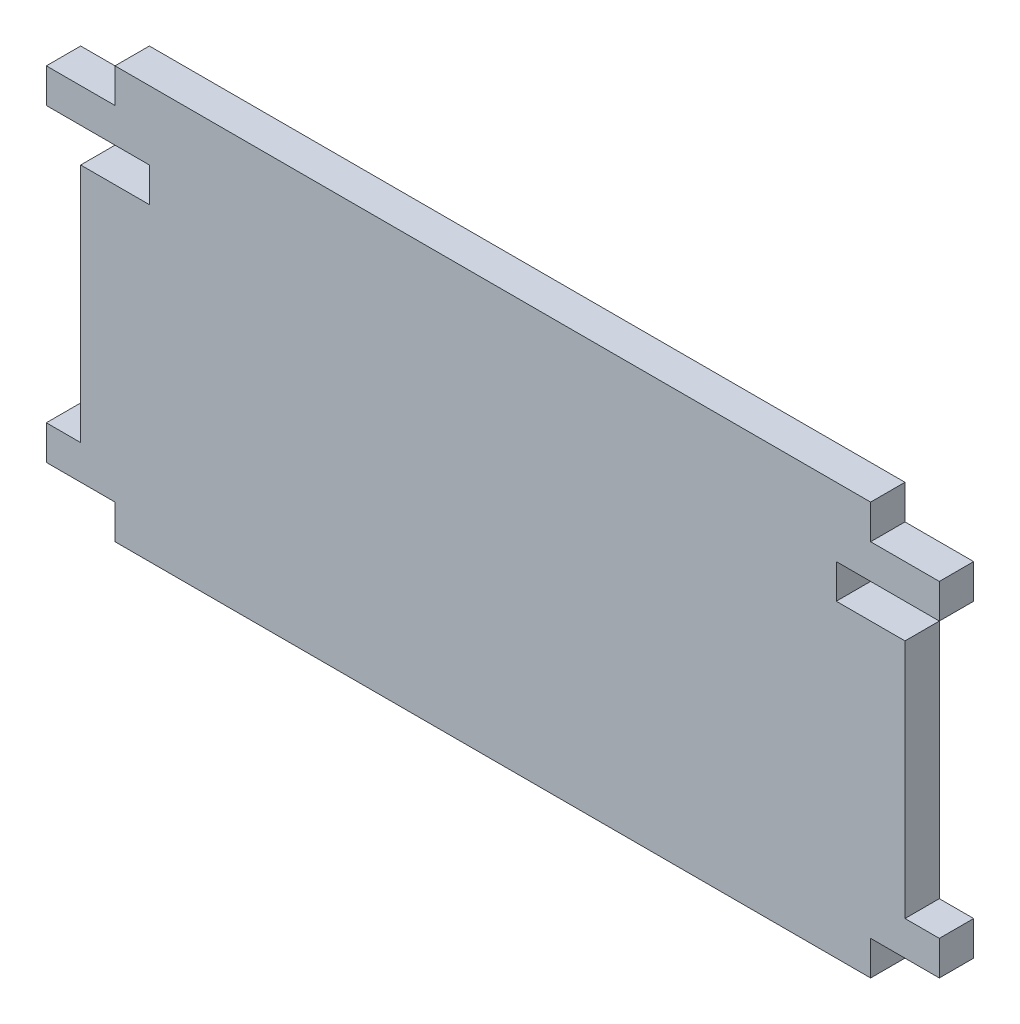
ISO-10303-21;
HEADER;
FILE_DESCRIPTION(('STEP AP214'),'2;1');
FILE_NAME('part.step','',(''),(''),'','','');
FILE_SCHEMA(('AUTOMOTIVE_DESIGN { 1 0 10303 214 1 1 1 1 }'));
ENDSEC;
DATA;
#1=APPLICATION_CONTEXT('core data for automotive mechanical design processes');
#2=APPLICATION_PROTOCOL_DEFINITION('international standard','automotive_design',2000,#1);
#3=PRODUCT_CONTEXT('',#1,'mechanical');
#4=PRODUCT('Part','Part','',(#3));
#5=PRODUCT_RELATED_PRODUCT_CATEGORY('part','',(#4));
#6=PRODUCT_DEFINITION_FORMATION('','',#4);
#7=PRODUCT_DEFINITION_CONTEXT('part definition',#1,'design');
#8=PRODUCT_DEFINITION('design','',#6,#7);
#9=PRODUCT_DEFINITION_SHAPE('','',#8);
#10=(LENGTH_UNIT() NAMED_UNIT(*) SI_UNIT(.MILLI.,.METRE.));
#11=(NAMED_UNIT(*) PLANE_ANGLE_UNIT() SI_UNIT($,.RADIAN.));
#12=(NAMED_UNIT(*) SI_UNIT($,.STERADIAN.) SOLID_ANGLE_UNIT());
#13=UNCERTAINTY_MEASURE_WITH_UNIT(LENGTH_MEASURE(1.E-05),#10,'distance_accuracy_value','');
#14=(GEOMETRIC_REPRESENTATION_CONTEXT(3) GLOBAL_UNCERTAINTY_ASSIGNED_CONTEXT((#13)) GLOBAL_UNIT_ASSIGNED_CONTEXT((#10,
#11,#12)) REPRESENTATION_CONTEXT('',''));
#15=CARTESIAN_POINT('',(0.,0.,0.));
#16=DIRECTION('',(0.,0.,1.));
#17=DIRECTION('',(1.,0.,0.));
#18=AXIS2_PLACEMENT_3D('',#15,#16,#17);
#19=CARTESIAN_POINT('',(215.71307345283,66.675,-6.34999999999999));
#20=DIRECTION('',(0.,0.,-1.));
#21=DIRECTION('',(-1.,0.,0.));
#22=AXIS2_PLACEMENT_3D('',#19,#20,#21);
#23=PLANE('',#22);
#24=DIRECTION('',(1.,0.,0.));
#25=VECTOR('',#24,1.);
#26=CARTESIAN_POINT('',(-57.15,53.975,-6.34999999999999));
#27=LINE('',#26,#25);
#28=CARTESIAN_POINT('',(-50.8,53.975,-6.34999999999999));
#29=VERTEX_POINT('',#28);
#30=CARTESIAN_POINT('',(-38.1,53.975,-6.34999999999999));
#31=VERTEX_POINT('',#30);
#32=EDGE_CURVE('E356',#29,#31,#27,.T.);
#33=ORIENTED_EDGE('',*,*,#32,.T.);
#34=DIRECTION('',(0.,1.,0.));
#35=VECTOR('',#34,1.);
#36=CARTESIAN_POINT('',(-38.1,53.975,-6.34999999999999));
#37=LINE('',#36,#35);
#38=CARTESIAN_POINT('',(-38.1,60.325,-6.34999999999999));
#39=VERTEX_POINT('',#38);
#40=EDGE_CURVE('E362',#31,#39,#37,.T.);
#41=ORIENTED_EDGE('',*,*,#40,.T.);
#42=DIRECTION('',(1.,0.,0.));
#43=VECTOR('',#42,1.);
#44=CARTESIAN_POINT('',(-57.15,60.325,-6.34999999999999));
#45=LINE('',#44,#43);
#46=CARTESIAN_POINT('',(-57.15,60.325,-6.34999999999999));
#47=VERTEX_POINT('',#46);
#48=EDGE_CURVE('E223',#47,#39,#45,.T.);
#49=ORIENTED_EDGE('',*,*,#48,.F.);
#50=DIRECTION('',(0.,-1.,0.));
#51=VECTOR('',#50,1.);
#52=CARTESIAN_POINT('',(-57.15,66.675,-6.34999999999999));
#53=LINE('',#52,#51);
#54=CARTESIAN_POINT('',(-57.15,66.675,-6.34999999999999));
#55=VERTEX_POINT('',#54);
#56=EDGE_CURVE('E227',#55,#47,#53,.T.);
#57=ORIENTED_EDGE('',*,*,#56,.F.);
#58=DIRECTION('',(-1.,0.,0.));
#59=VECTOR('',#58,1.);
#60=CARTESIAN_POINT('',(-44.45,66.675,-6.34999999999999));
#61=LINE('',#60,#59);
#62=CARTESIAN_POINT('',(-44.45,66.675,-6.34999999999999));
#63=VERTEX_POINT('',#62);
#64=EDGE_CURVE('E231',#63,#55,#61,.T.);
#65=ORIENTED_EDGE('',*,*,#64,.F.);
#66=DIRECTION('',(0.,-1.,0.));
#67=VECTOR('',#66,1.);
#68=CARTESIAN_POINT('',(-44.45,73.025,-6.34999999999999));
#69=LINE('',#68,#67);
#70=CARTESIAN_POINT('',(-44.45,73.025,-6.34999999999999));
#71=VERTEX_POINT('',#70);
#72=EDGE_CURVE('E235',#71,#63,#69,.T.);
#73=ORIENTED_EDGE('',*,*,#72,.F.);
#74=DIRECTION('',(-1.,0.,0.));
#75=VECTOR('',#74,1.);
#76=CARTESIAN_POINT('',(95.2499999999999,73.025,-6.34999999999999));
#77=LINE('',#76,#75);
#78=CARTESIAN_POINT('',(95.2499999999999,73.025,-6.34999999999999));
#79=VERTEX_POINT('',#78);
#80=EDGE_CURVE('E239',#79,#71,#77,.T.);
#81=ORIENTED_EDGE('',*,*,#80,.F.);
#82=DIRECTION('',(0.,1.,0.));
#83=VECTOR('',#82,1.);
#84=CARTESIAN_POINT('',(95.2499999999999,66.675,-6.34999999999999));
#85=LINE('',#84,#83);
#86=CARTESIAN_POINT('',(95.2499999999999,66.675,-6.34999999999999));
#87=VERTEX_POINT('',#86);
#88=EDGE_CURVE('E243',#87,#79,#85,.T.);
#89=ORIENTED_EDGE('',*,*,#88,.F.);
#90=DIRECTION('',(-1.,0.,0.));
#91=VECTOR('',#90,1.);
#92=CARTESIAN_POINT('',(107.95,66.675,-6.34999999999999));
#93=LINE('',#92,#91);
#94=CARTESIAN_POINT('',(107.95,66.675,-6.34999999999999));
#95=VERTEX_POINT('',#94);
#96=EDGE_CURVE('E247',#95,#87,#93,.T.);
#97=ORIENTED_EDGE('',*,*,#96,.F.);
#98=DIRECTION('',(0.,1.,0.));
#99=VECTOR('',#98,1.);
#100=CARTESIAN_POINT('',(107.95,60.325,-6.34999999999999));
#101=LINE('',#100,#99);
#102=CARTESIAN_POINT('',(107.95,60.325,-6.34999999999999));
#103=VERTEX_POINT('',#102);
#104=EDGE_CURVE('E251',#103,#95,#101,.T.);
#105=ORIENTED_EDGE('',*,*,#104,.F.);
#106=DIRECTION('',(1.,0.,0.));
#107=VECTOR('',#106,1.);
#108=CARTESIAN_POINT('',(101.6,60.325,-6.34999999999999));
#109=LINE('',#108,#107);
#110=CARTESIAN_POINT('',(88.8999999999999,60.325,-6.34999999999999));
#111=VERTEX_POINT('',#110);
#112=EDGE_CURVE('E255',#111,#103,#109,.T.);
#113=ORIENTED_EDGE('',*,*,#112,.F.);
#114=DIRECTION('',(0.,-1.,0.));
#115=VECTOR('',#114,1.);
#116=CARTESIAN_POINT('',(88.8999999999999,60.325,-6.34999999999999));
#117=LINE('',#116,#115);
#118=CARTESIAN_POINT('',(88.8999999999999,53.975,-6.34999999999999));
#119=VERTEX_POINT('',#118);
#120=EDGE_CURVE('E294',#111,#119,#117,.T.);
#121=ORIENTED_EDGE('',*,*,#120,.T.);
#122=DIRECTION('',(1.,0.,0.));
#123=VECTOR('',#122,1.);
#124=CARTESIAN_POINT('',(88.8999999999999,53.975,-6.34999999999999));
#125=LINE('',#124,#123);
#126=CARTESIAN_POINT('',(101.6,53.975,-6.34999999999999));
#127=VERTEX_POINT('',#126);
#128=EDGE_CURVE('E285',#119,#127,#125,.T.);
#129=ORIENTED_EDGE('',*,*,#128,.T.);
#130=DIRECTION('',(0.,1.,0.));
#131=VECTOR('',#130,1.);
#132=CARTESIAN_POINT('',(101.6,9.525,-6.34999999999999));
#133=LINE('',#132,#131);
#134=CARTESIAN_POINT('',(101.6,9.525,-6.34999999999999));
#135=VERTEX_POINT('',#134);
#136=EDGE_CURVE('E110',#135,#127,#133,.T.);
#137=ORIENTED_EDGE('',*,*,#136,.F.);
#138=DIRECTION('',(-1.,0.,0.));
#139=VECTOR('',#138,1.);
#140=CARTESIAN_POINT('',(107.95,9.525,-6.34999999999999));
#141=LINE('',#140,#139);
#142=CARTESIAN_POINT('',(107.95,9.525,-6.34999999999999));
#143=VERTEX_POINT('',#142);
#144=EDGE_CURVE('E115',#143,#135,#141,.T.);
#145=ORIENTED_EDGE('',*,*,#144,.F.);
#146=DIRECTION('',(0.,1.,0.));
#147=VECTOR('',#146,1.);
#148=CARTESIAN_POINT('',(107.95,3.175,-6.34999999999999));
#149=LINE('',#148,#147);
#150=CARTESIAN_POINT('',(107.95,3.175,-6.34999999999999));
#151=VERTEX_POINT('',#150);
#152=EDGE_CURVE('E174',#151,#143,#149,.T.);
#153=ORIENTED_EDGE('',*,*,#152,.F.);
#154=DIRECTION('',(1.,0.,0.));
#155=VECTOR('',#154,1.);
#156=CARTESIAN_POINT('',(95.2499999999999,3.175,-6.34999999999999));
#157=LINE('',#156,#155);
#158=CARTESIAN_POINT('',(95.2499999999999,3.175,-6.34999999999999));
#159=VERTEX_POINT('',#158);
#160=EDGE_CURVE('E194',#159,#151,#157,.T.);
#161=ORIENTED_EDGE('',*,*,#160,.F.);
#162=DIRECTION('',(0.,1.,0.));
#163=VECTOR('',#162,1.);
#164=CARTESIAN_POINT('',(95.2499999999999,-3.175,-6.34999999999999));
#165=LINE('',#164,#163);
#166=CARTESIAN_POINT('',(95.2499999999999,-3.175,-6.34999999999999));
#167=VERTEX_POINT('',#166);
#168=EDGE_CURVE('E197',#167,#159,#165,.T.);
#169=ORIENTED_EDGE('',*,*,#168,.F.);
#170=DIRECTION('',(1.,0.,0.));
#171=VECTOR('',#170,1.);
#172=CARTESIAN_POINT('',(-44.45,-3.175,-6.34999999999999));
#173=LINE('',#172,#171);
#174=CARTESIAN_POINT('',(-44.45,-3.175,-6.34999999999999));
#175=VERTEX_POINT('',#174);
#176=EDGE_CURVE('E201',#175,#167,#173,.T.);
#177=ORIENTED_EDGE('',*,*,#176,.F.);
#178=DIRECTION('',(0.,-1.,0.));
#179=VECTOR('',#178,1.);
#180=CARTESIAN_POINT('',(-44.45,3.175,-6.34999999999999));
#181=LINE('',#180,#179);
#182=CARTESIAN_POINT('',(-44.45,3.175,-6.34999999999999));
#183=VERTEX_POINT('',#182);
#184=EDGE_CURVE('E205',#183,#175,#181,.T.);
#185=ORIENTED_EDGE('',*,*,#184,.F.);
#186=DIRECTION('',(1.,0.,0.));
#187=VECTOR('',#186,1.);
#188=CARTESIAN_POINT('',(-57.15,3.175,-6.34999999999999));
#189=LINE('',#188,#187);
#190=CARTESIAN_POINT('',(-57.15,3.175,-6.34999999999999));
#191=VERTEX_POINT('',#190);
#192=EDGE_CURVE('E209',#191,#183,#189,.T.);
#193=ORIENTED_EDGE('',*,*,#192,.F.);
#194=DIRECTION('',(0.,-1.,0.));
#195=VECTOR('',#194,1.);
#196=CARTESIAN_POINT('',(-57.15,9.525,-6.34999999999999));
#197=LINE('',#196,#195);
#198=CARTESIAN_POINT('',(-57.15,9.525,-6.34999999999999));
#199=VERTEX_POINT('',#198);
#200=EDGE_CURVE('E213',#199,#191,#197,.T.);
#201=ORIENTED_EDGE('',*,*,#200,.F.);
#202=DIRECTION('',(-1.,0.,0.));
#203=VECTOR('',#202,1.);
#204=CARTESIAN_POINT('',(-50.8,9.525,-6.34999999999999));
#205=LINE('',#204,#203);
#206=CARTESIAN_POINT('',(-50.8,9.525,-6.34999999999999));
#207=VERTEX_POINT('',#206);
#208=EDGE_CURVE('E217',#207,#199,#205,.T.);
#209=ORIENTED_EDGE('',*,*,#208,.F.);
#210=DIRECTION('',(0.,-1.,0.));
#211=VECTOR('',#210,1.);
#212=CARTESIAN_POINT('',(-50.8,60.325,-6.34999999999999));
#213=LINE('',#212,#211);
#214=EDGE_CURVE('E221',#29,#207,#213,.T.);
#215=ORIENTED_EDGE('',*,*,#214,.F.);
#216=EDGE_LOOP('',(#33,#41,#49,#57,#65,#73,#81,#89,#97,#105,#113,#121,#129,#137,#145,#153,#161,
#169,#177,#185,#193,#201,#209,#215));
#217=FACE_BOUND('',#216,.T.);
#218=ADVANCED_FACE('F33',(#217),#23,.T.);
#219=CARTESIAN_POINT('',(0.,0.,0.));
#220=DIRECTION('',(0.,0.,1.));
#221=DIRECTION('',(1.,0.,0.));
#222=AXIS2_PLACEMENT_3D('',#219,#220,#221);
#223=PLANE('',#222);
#224=DIRECTION('',(1.,0.,0.));
#225=VECTOR('',#224,1.);
#226=CARTESIAN_POINT('',(-57.15,53.975,0.));
#227=LINE('',#226,#225);
#228=CARTESIAN_POINT('',(-50.8,53.975,0.));
#229=VERTEX_POINT('',#228);
#230=CARTESIAN_POINT('',(-38.1,53.975,0.));
#231=VERTEX_POINT('',#230);
#232=EDGE_CURVE('E359',#229,#231,#227,.T.);
#233=ORIENTED_EDGE('',*,*,#232,.F.);
#234=DIRECTION('',(0.,-1.,0.));
#235=VECTOR('',#234,1.);
#236=CARTESIAN_POINT('',(-50.8,60.325,0.));
#237=LINE('',#236,#235);
#238=CARTESIAN_POINT('',(-50.8,9.525,0.));
#239=VERTEX_POINT('',#238);
#240=EDGE_CURVE('E326',#229,#239,#237,.T.);
#241=ORIENTED_EDGE('',*,*,#240,.T.);
#242=DIRECTION('',(-1.,0.,0.));
#243=VECTOR('',#242,1.);
#244=CARTESIAN_POINT('',(-50.8,9.525,0.));
#245=LINE('',#244,#243);
#246=CARTESIAN_POINT('',(-57.15,9.525,0.));
#247=VERTEX_POINT('',#246);
#248=EDGE_CURVE('E328',#239,#247,#245,.T.);
#249=ORIENTED_EDGE('',*,*,#248,.T.);
#250=DIRECTION('',(0.,-1.,0.));
#251=VECTOR('',#250,1.);
#252=CARTESIAN_POINT('',(-57.15,9.525,0.));
#253=LINE('',#252,#251);
#254=CARTESIAN_POINT('',(-57.15,3.175,0.));
#255=VERTEX_POINT('',#254);
#256=EDGE_CURVE('E331',#247,#255,#253,.T.);
#257=ORIENTED_EDGE('',*,*,#256,.T.);
#258=DIRECTION('',(1.,0.,0.));
#259=VECTOR('',#258,1.);
#260=CARTESIAN_POINT('',(-57.15,3.175,0.));
#261=LINE('',#260,#259);
#262=CARTESIAN_POINT('',(-44.45,3.175,0.));
#263=VERTEX_POINT('',#262);
#264=EDGE_CURVE('E334',#255,#263,#261,.T.);
#265=ORIENTED_EDGE('',*,*,#264,.T.);
#266=DIRECTION('',(0.,-1.,0.));
#267=VECTOR('',#266,1.);
#268=CARTESIAN_POINT('',(-44.45,3.175,0.));
#269=LINE('',#268,#267);
#270=CARTESIAN_POINT('',(-44.45,-3.175,0.));
#271=VERTEX_POINT('',#270);
#272=EDGE_CURVE('E337',#263,#271,#269,.T.);
#273=ORIENTED_EDGE('',*,*,#272,.T.);
#274=DIRECTION('',(1.,0.,0.));
#275=VECTOR('',#274,1.);
#276=CARTESIAN_POINT('',(-44.45,-3.175,0.));
#277=LINE('',#276,#275);
#278=CARTESIAN_POINT('',(95.2499999999999,-3.175,0.));
#279=VERTEX_POINT('',#278);
#280=EDGE_CURVE('E340',#271,#279,#277,.T.);
#281=ORIENTED_EDGE('',*,*,#280,.T.);
#282=DIRECTION('',(0.,1.,0.));
#283=VECTOR('',#282,1.);
#284=CARTESIAN_POINT('',(95.2499999999999,-3.175,0.));
#285=LINE('',#284,#283);
#286=CARTESIAN_POINT('',(95.2499999999999,3.175,0.));
#287=VERTEX_POINT('',#286);
#288=EDGE_CURVE('E193',#279,#287,#285,.T.);
#289=ORIENTED_EDGE('',*,*,#288,.T.);
#290=DIRECTION('',(1.,0.,0.));
#291=VECTOR('',#290,1.);
#292=CARTESIAN_POINT('',(95.2499999999999,3.175,0.));
#293=LINE('',#292,#291);
#294=CARTESIAN_POINT('',(107.95,3.175,0.));
#295=VERTEX_POINT('',#294);
#296=EDGE_CURVE('E186',#287,#295,#293,.T.);
#297=ORIENTED_EDGE('',*,*,#296,.T.);
#298=DIRECTION('',(0.,1.,0.));
#299=VECTOR('',#298,1.);
#300=CARTESIAN_POINT('',(107.95,3.175,0.));
#301=LINE('',#300,#299);
#302=CARTESIAN_POINT('',(107.95,9.525,0.));
#303=VERTEX_POINT('',#302);
#304=EDGE_CURVE('E172',#295,#303,#301,.T.);
#305=ORIENTED_EDGE('',*,*,#304,.T.);
#306=DIRECTION('',(-1.,0.,0.));
#307=VECTOR('',#306,1.);
#308=CARTESIAN_POINT('',(107.95,9.525,0.));
#309=LINE('',#308,#307);
#310=CARTESIAN_POINT('',(101.6,9.525,0.));
#311=VERTEX_POINT('',#310);
#312=EDGE_CURVE('E177',#303,#311,#309,.T.);
#313=ORIENTED_EDGE('',*,*,#312,.T.);
#314=DIRECTION('',(0.,1.,0.));
#315=VECTOR('',#314,1.);
#316=CARTESIAN_POINT('',(101.6,9.525,0.));
#317=LINE('',#316,#315);
#318=CARTESIAN_POINT('',(101.6,53.975,0.));
#319=VERTEX_POINT('',#318);
#320=EDGE_CURVE('E181',#311,#319,#317,.T.);
#321=ORIENTED_EDGE('',*,*,#320,.T.);
#322=DIRECTION('',(1.,0.,0.));
#323=VECTOR('',#322,1.);
#324=CARTESIAN_POINT('',(88.8999999999999,53.975,0.));
#325=LINE('',#324,#323);
#326=CARTESIAN_POINT('',(88.8999999999999,53.975,0.));
#327=VERTEX_POINT('',#326);
#328=EDGE_CURVE('E289',#327,#319,#325,.T.);
#329=ORIENTED_EDGE('',*,*,#328,.F.);
#330=DIRECTION('',(0.,-1.,0.));
#331=VECTOR('',#330,1.);
#332=CARTESIAN_POINT('',(88.8999999999999,60.325,0.));
#333=LINE('',#332,#331);
#334=CARTESIAN_POINT('',(88.8999999999999,60.325,0.));
#335=VERTEX_POINT('',#334);
#336=EDGE_CURVE('E348',#335,#327,#333,.T.);
#337=ORIENTED_EDGE('',*,*,#336,.F.);
#338=DIRECTION('',(1.,0.,0.));
#339=VECTOR('',#338,1.);
#340=CARTESIAN_POINT('',(101.6,60.325,0.));
#341=LINE('',#340,#339);
#342=CARTESIAN_POINT('',(107.95,60.325,0.));
#343=VERTEX_POINT('',#342);
#344=EDGE_CURVE('E298',#335,#343,#341,.T.);
#345=ORIENTED_EDGE('',*,*,#344,.T.);
#346=DIRECTION('',(0.,1.,0.));
#347=VECTOR('',#346,1.);
#348=CARTESIAN_POINT('',(107.95,60.325,0.));
#349=LINE('',#348,#347);
#350=CARTESIAN_POINT('',(107.95,66.675,0.));
#351=VERTEX_POINT('',#350);
#352=EDGE_CURVE('E300',#343,#351,#349,.T.);
#353=ORIENTED_EDGE('',*,*,#352,.T.);
#354=DIRECTION('',(-1.,0.,0.));
#355=VECTOR('',#354,1.);
#356=CARTESIAN_POINT('',(107.95,66.675,0.));
#357=LINE('',#356,#355);
#358=CARTESIAN_POINT('',(95.2499999999999,66.675,0.));
#359=VERTEX_POINT('',#358);
#360=EDGE_CURVE('E305',#351,#359,#357,.T.);
#361=ORIENTED_EDGE('',*,*,#360,.T.);
#362=DIRECTION('',(0.,1.,0.));
#363=VECTOR('',#362,1.);
#364=CARTESIAN_POINT('',(95.2499999999999,66.675,0.));
#365=LINE('',#364,#363);
#366=CARTESIAN_POINT('',(95.2499999999999,73.025,0.));
#367=VERTEX_POINT('',#366);
#368=EDGE_CURVE('E308',#359,#367,#365,.T.);
#369=ORIENTED_EDGE('',*,*,#368,.T.);
#370=DIRECTION('',(-1.,0.,0.));
#371=VECTOR('',#370,1.);
#372=CARTESIAN_POINT('',(95.2499999999999,73.025,0.));
#373=LINE('',#372,#371);
#374=CARTESIAN_POINT('',(-44.45,73.025,0.));
#375=VERTEX_POINT('',#374);
#376=EDGE_CURVE('E311',#367,#375,#373,.T.);
#377=ORIENTED_EDGE('',*,*,#376,.T.);
#378=DIRECTION('',(0.,-1.,0.));
#379=VECTOR('',#378,1.);
#380=CARTESIAN_POINT('',(-44.45,73.025,0.));
#381=LINE('',#380,#379);
#382=CARTESIAN_POINT('',(-44.45,66.675,0.));
#383=VERTEX_POINT('',#382);
#384=EDGE_CURVE('E314',#375,#383,#381,.T.);
#385=ORIENTED_EDGE('',*,*,#384,.T.);
#386=DIRECTION('',(-1.,0.,0.));
#387=VECTOR('',#386,1.);
#388=CARTESIAN_POINT('',(-44.45,66.675,0.));
#389=LINE('',#388,#387);
#390=CARTESIAN_POINT('',(-57.15,66.675,0.));
#391=VERTEX_POINT('',#390);
#392=EDGE_CURVE('E317',#383,#391,#389,.T.);
#393=ORIENTED_EDGE('',*,*,#392,.T.);
#394=DIRECTION('',(0.,-1.,0.));
#395=VECTOR('',#394,1.);
#396=CARTESIAN_POINT('',(-57.15,66.675,0.));
#397=LINE('',#396,#395);
#398=CARTESIAN_POINT('',(-57.15,60.325,0.));
#399=VERTEX_POINT('',#398);
#400=EDGE_CURVE('E320',#391,#399,#397,.T.);
#401=ORIENTED_EDGE('',*,*,#400,.T.);
#402=DIRECTION('',(1.,0.,0.));
#403=VECTOR('',#402,1.);
#404=CARTESIAN_POINT('',(-57.15,60.325,0.));
#405=LINE('',#404,#403);
#406=CARTESIAN_POINT('',(-38.1,60.325,0.));
#407=VERTEX_POINT('',#406);
#408=EDGE_CURVE('E323',#399,#407,#405,.T.);
#409=ORIENTED_EDGE('',*,*,#408,.T.);
#410=DIRECTION('',(0.,1.,0.));
#411=VECTOR('',#410,1.);
#412=CARTESIAN_POINT('',(-38.1,53.975,0.));
#413=LINE('',#412,#411);
#414=EDGE_CURVE('E363',#231,#407,#413,.T.);
#415=ORIENTED_EDGE('',*,*,#414,.F.);
#416=EDGE_LOOP('',(#233,#241,#249,#257,#265,#273,#281,#289,#297,#305,#313,#321,#329,#337,#345,
#353,#361,#369,#377,#385,#393,#401,#409,#415));
#417=FACE_BOUND('',#416,.T.);
#418=ADVANCED_FACE('F184',(#417),#223,.T.);
#419=CARTESIAN_POINT('',(107.95,3.175,-188.18632750361));
#420=DIRECTION('',(1.,0.,0.));
#421=DIRECTION('',(0.,0.,-1.));
#422=AXIS2_PLACEMENT_3D('',#419,#420,#421);
#423=PLANE('',#422);
#424=DIRECTION('',(0.,0.,1.));
#425=VECTOR('',#424,1.);
#426=CARTESIAN_POINT('',(107.95,3.175,-188.18632750361));
#427=LINE('',#426,#425);
#428=EDGE_CURVE('E49',#151,#295,#427,.T.);
#429=ORIENTED_EDGE('',*,*,#428,.F.);
#430=ORIENTED_EDGE('',*,*,#152,.T.);
#431=DIRECTION('',(0.,0.,1.));
#432=VECTOR('',#431,1.);
#433=CARTESIAN_POINT('',(107.95,9.525,-188.18632750361));
#434=LINE('',#433,#432);
#435=EDGE_CURVE('E169',#143,#303,#434,.T.);
#436=ORIENTED_EDGE('',*,*,#435,.T.);
#437=ORIENTED_EDGE('',*,*,#304,.F.);
#438=EDGE_LOOP('',(#429,#430,#436,#437));
#439=FACE_BOUND('',#438,.T.);
#440=ADVANCED_FACE('F170',(#439),#423,.T.);
#441=CARTESIAN_POINT('',(107.95,9.525,-188.18632750361));
#442=DIRECTION('',(0.,1.,0.));
#443=DIRECTION('',(0.,0.,1.));
#444=AXIS2_PLACEMENT_3D('',#441,#442,#443);
#445=PLANE('',#444);
#446=ORIENTED_EDGE('',*,*,#435,.F.);
#447=ORIENTED_EDGE('',*,*,#144,.T.);
#448=DIRECTION('',(0.,0.,1.));
#449=VECTOR('',#448,1.);
#450=CARTESIAN_POINT('',(101.6,9.525,-188.18632750361));
#451=LINE('',#450,#449);
#452=EDGE_CURVE('E164',#135,#311,#451,.T.);
#453=ORIENTED_EDGE('',*,*,#452,.T.);
#454=ORIENTED_EDGE('',*,*,#312,.F.);
#455=EDGE_LOOP('',(#446,#447,#453,#454));
#456=FACE_BOUND('',#455,.T.);
#457=ADVANCED_FACE('F178',(#456),#445,.T.);
#458=CARTESIAN_POINT('',(101.6,9.525,-188.18632750361));
#459=DIRECTION('',(1.,0.,0.));
#460=DIRECTION('',(0.,0.,-1.));
#461=AXIS2_PLACEMENT_3D('',#458,#459,#460);
#462=PLANE('',#461);
#463=DIRECTION('',(0.,0.,-1.));
#464=VECTOR('',#463,1.);
#465=CARTESIAN_POINT('',(101.6,53.975,-188.18632750361));
#466=LINE('',#465,#464);
#467=EDGE_CURVE('E41',#319,#127,#466,.T.);
#468=ORIENTED_EDGE('',*,*,#467,.F.);
#469=ORIENTED_EDGE('',*,*,#320,.F.);
#470=ORIENTED_EDGE('',*,*,#452,.F.);
#471=ORIENTED_EDGE('',*,*,#136,.T.);
#472=EDGE_LOOP('',(#468,#469,#470,#471));
#473=FACE_BOUND('',#472,.T.);
#474=ADVANCED_FACE('F297',(#473),#462,.T.);
#475=CARTESIAN_POINT('',(101.6,60.325,-188.18632750361));
#476=DIRECTION('',(0.,-1.,0.));
#477=DIRECTION('',(0.,0.,-1.));
#478=AXIS2_PLACEMENT_3D('',#475,#476,#477);
#479=PLANE('',#478);
#480=ORIENTED_EDGE('',*,*,#344,.F.);
#481=DIRECTION('',(0.,0.,1.));
#482=VECTOR('',#481,1.);
#483=CARTESIAN_POINT('',(88.8999999999999,60.325,-6.34999999999999));
#484=LINE('',#483,#482);
#485=EDGE_CURVE('E295',#111,#335,#484,.T.);
#486=ORIENTED_EDGE('',*,*,#485,.F.);
#487=ORIENTED_EDGE('',*,*,#112,.T.);
#488=DIRECTION('',(0.,0.,1.));
#489=VECTOR('',#488,1.);
#490=CARTESIAN_POINT('',(107.95,60.325,-188.18632750361));
#491=LINE('',#490,#489);
#492=EDGE_CURVE('E254',#103,#343,#491,.T.);
#493=ORIENTED_EDGE('',*,*,#492,.T.);
#494=EDGE_LOOP('',(#480,#486,#487,#493));
#495=FACE_BOUND('',#494,.T.);
#496=ADVANCED_FACE('F405',(#495),#479,.T.);
#497=CARTESIAN_POINT('',(107.95,60.325,-188.18632750361));
#498=DIRECTION('',(1.,0.,0.));
#499=DIRECTION('',(0.,0.,-1.));
#500=AXIS2_PLACEMENT_3D('',#497,#498,#499);
#501=PLANE('',#500);
#502=ORIENTED_EDGE('',*,*,#492,.F.);
#503=ORIENTED_EDGE('',*,*,#104,.T.);
#504=DIRECTION('',(0.,0.,1.));
#505=VECTOR('',#504,1.);
#506=CARTESIAN_POINT('',(107.95,66.675,-188.18632750361));
#507=LINE('',#506,#505);
#508=EDGE_CURVE('E250',#95,#351,#507,.T.);
#509=ORIENTED_EDGE('',*,*,#508,.T.);
#510=ORIENTED_EDGE('',*,*,#352,.F.);
#511=EDGE_LOOP('',(#502,#503,#509,#510));
#512=FACE_BOUND('',#511,.T.);
#513=ADVANCED_FACE('F408',(#512),#501,.T.);
#514=CARTESIAN_POINT('',(107.95,66.675,-188.18632750361));
#515=DIRECTION('',(0.,1.,0.));
#516=DIRECTION('',(0.,0.,1.));
#517=AXIS2_PLACEMENT_3D('',#514,#515,#516);
#518=PLANE('',#517);
#519=ORIENTED_EDGE('',*,*,#508,.F.);
#520=ORIENTED_EDGE('',*,*,#96,.T.);
#521=DIRECTION('',(0.,0.,1.));
#522=VECTOR('',#521,1.);
#523=CARTESIAN_POINT('',(95.2499999999999,66.675,-188.18632750361));
#524=LINE('',#523,#522);
#525=EDGE_CURVE('E246',#87,#359,#524,.T.);
#526=ORIENTED_EDGE('',*,*,#525,.T.);
#527=ORIENTED_EDGE('',*,*,#360,.F.);
#528=EDGE_LOOP('',(#519,#520,#526,#527));
#529=FACE_BOUND('',#528,.T.);
#530=ADVANCED_FACE('F412',(#529),#518,.T.);
#531=CARTESIAN_POINT('',(95.2499999999999,66.675,-188.18632750361));
#532=DIRECTION('',(1.,0.,0.));
#533=DIRECTION('',(0.,0.,-1.));
#534=AXIS2_PLACEMENT_3D('',#531,#532,#533);
#535=PLANE('',#534);
#536=ORIENTED_EDGE('',*,*,#525,.F.);
#537=ORIENTED_EDGE('',*,*,#88,.T.);
#538=DIRECTION('',(0.,0.,1.));
#539=VECTOR('',#538,1.);
#540=CARTESIAN_POINT('',(95.2499999999999,73.025,-188.18632750361));
#541=LINE('',#540,#539);
#542=EDGE_CURVE('E242',#79,#367,#541,.T.);
#543=ORIENTED_EDGE('',*,*,#542,.T.);
#544=ORIENTED_EDGE('',*,*,#368,.F.);
#545=EDGE_LOOP('',(#536,#537,#543,#544));
#546=FACE_BOUND('',#545,.T.);
#547=ADVANCED_FACE('F417',(#546),#535,.T.);
#548=CARTESIAN_POINT('',(95.2499999999999,73.025,-188.18632750361));
#549=DIRECTION('',(0.,1.,0.));
#550=DIRECTION('',(0.,0.,1.));
#551=AXIS2_PLACEMENT_3D('',#548,#549,#550);
#552=PLANE('',#551);
#553=ORIENTED_EDGE('',*,*,#542,.F.);
#554=ORIENTED_EDGE('',*,*,#80,.T.);
#555=DIRECTION('',(0.,0.,1.));
#556=VECTOR('',#555,1.);
#557=CARTESIAN_POINT('',(-44.45,73.025,-188.18632750361));
#558=LINE('',#557,#556);
#559=EDGE_CURVE('E238',#71,#375,#558,.T.);
#560=ORIENTED_EDGE('',*,*,#559,.T.);
#561=ORIENTED_EDGE('',*,*,#376,.F.);
#562=EDGE_LOOP('',(#553,#554,#560,#561));
#563=FACE_BOUND('',#562,.T.);
#564=ADVANCED_FACE('F420',(#563),#552,.T.);
#565=CARTESIAN_POINT('',(-44.45,73.025,-188.18632750361));
#566=DIRECTION('',(-1.,0.,0.));
#567=DIRECTION('',(0.,0.,1.));
#568=AXIS2_PLACEMENT_3D('',#565,#566,#567);
#569=PLANE('',#568);
#570=ORIENTED_EDGE('',*,*,#559,.F.);
#571=ORIENTED_EDGE('',*,*,#72,.T.);
#572=DIRECTION('',(0.,0.,1.));
#573=VECTOR('',#572,1.);
#574=CARTESIAN_POINT('',(-44.45,66.675,-188.18632750361));
#575=LINE('',#574,#573);
#576=EDGE_CURVE('E234',#63,#383,#575,.T.);
#577=ORIENTED_EDGE('',*,*,#576,.T.);
#578=ORIENTED_EDGE('',*,*,#384,.F.);
#579=EDGE_LOOP('',(#570,#571,#577,#578));
#580=FACE_BOUND('',#579,.T.);
#581=ADVANCED_FACE('F424',(#580),#569,.T.);
#582=CARTESIAN_POINT('',(-44.45,66.675,-188.18632750361));
#583=DIRECTION('',(0.,1.,0.));
#584=DIRECTION('',(0.,0.,1.));
#585=AXIS2_PLACEMENT_3D('',#582,#583,#584);
#586=PLANE('',#585);
#587=ORIENTED_EDGE('',*,*,#576,.F.);
#588=ORIENTED_EDGE('',*,*,#64,.T.);
#589=DIRECTION('',(0.,0.,1.));
#590=VECTOR('',#589,1.);
#591=CARTESIAN_POINT('',(-57.15,66.675,-188.18632750361));
#592=LINE('',#591,#590);
#593=EDGE_CURVE('E230',#55,#391,#592,.T.);
#594=ORIENTED_EDGE('',*,*,#593,.T.);
#595=ORIENTED_EDGE('',*,*,#392,.F.);
#596=EDGE_LOOP('',(#587,#588,#594,#595));
#597=FACE_BOUND('',#596,.T.);
#598=ADVANCED_FACE('F429',(#597),#586,.T.);
#599=CARTESIAN_POINT('',(-57.15,66.675,-188.18632750361));
#600=DIRECTION('',(-1.,0.,0.));
#601=DIRECTION('',(0.,0.,1.));
#602=AXIS2_PLACEMENT_3D('',#599,#600,#601);
#603=PLANE('',#602);
#604=ORIENTED_EDGE('',*,*,#593,.F.);
#605=ORIENTED_EDGE('',*,*,#56,.T.);
#606=DIRECTION('',(0.,0.,1.));
#607=VECTOR('',#606,1.);
#608=CARTESIAN_POINT('',(-57.15,60.325,-188.18632750361));
#609=LINE('',#608,#607);
#610=EDGE_CURVE('E226',#47,#399,#609,.T.);
#611=ORIENTED_EDGE('',*,*,#610,.T.);
#612=ORIENTED_EDGE('',*,*,#400,.F.);
#613=EDGE_LOOP('',(#604,#605,#611,#612));
#614=FACE_BOUND('',#613,.T.);
#615=ADVANCED_FACE('F432',(#614),#603,.T.);
#616=CARTESIAN_POINT('',(-57.15,60.325,-188.18632750361));
#617=DIRECTION('',(0.,-1.,0.));
#618=DIRECTION('',(0.,0.,-1.));
#619=AXIS2_PLACEMENT_3D('',#616,#617,#618);
#620=PLANE('',#619);
#621=ORIENTED_EDGE('',*,*,#610,.F.);
#622=ORIENTED_EDGE('',*,*,#48,.T.);
#623=DIRECTION('',(0.,0.,1.));
#624=VECTOR('',#623,1.);
#625=CARTESIAN_POINT('',(-38.1,60.325,-6.34999999999999));
#626=LINE('',#625,#624);
#627=EDGE_CURVE('E353',#39,#407,#626,.T.);
#628=ORIENTED_EDGE('',*,*,#627,.T.);
#629=ORIENTED_EDGE('',*,*,#408,.F.);
#630=EDGE_LOOP('',(#621,#622,#628,#629));
#631=FACE_BOUND('',#630,.T.);
#632=ADVANCED_FACE('F435',(#631),#620,.T.);
#633=CARTESIAN_POINT('',(-50.8,60.325,-188.18632750361));
#634=DIRECTION('',(-1.,0.,0.));
#635=DIRECTION('',(0.,0.,1.));
#636=AXIS2_PLACEMENT_3D('',#633,#634,#635);
#637=PLANE('',#636);
#638=DIRECTION('',(0.,0.,1.));
#639=VECTOR('',#638,1.);
#640=CARTESIAN_POINT('',(-50.8,53.975,-188.18632750361));
#641=LINE('',#640,#639);
#642=EDGE_CURVE('E11',#29,#229,#641,.T.);
#643=ORIENTED_EDGE('',*,*,#642,.F.);
#644=ORIENTED_EDGE('',*,*,#214,.T.);
#645=DIRECTION('',(0.,0.,1.));
#646=VECTOR('',#645,1.);
#647=CARTESIAN_POINT('',(-50.8,9.525,-188.18632750361));
#648=LINE('',#647,#646);
#649=EDGE_CURVE('E220',#207,#239,#648,.T.);
#650=ORIENTED_EDGE('',*,*,#649,.T.);
#651=ORIENTED_EDGE('',*,*,#240,.F.);
#652=EDGE_LOOP('',(#643,#644,#650,#651));
#653=FACE_BOUND('',#652,.T.);
#654=ADVANCED_FACE('F439',(#653),#637,.T.);
#655=CARTESIAN_POINT('',(-50.8,9.525,-188.18632750361));
#656=DIRECTION('',(0.,1.,0.));
#657=DIRECTION('',(0.,0.,1.));
#658=AXIS2_PLACEMENT_3D('',#655,#656,#657);
#659=PLANE('',#658);
#660=ORIENTED_EDGE('',*,*,#649,.F.);
#661=ORIENTED_EDGE('',*,*,#208,.T.);
#662=DIRECTION('',(0.,0.,1.));
#663=VECTOR('',#662,1.);
#664=CARTESIAN_POINT('',(-57.15,9.525,-188.18632750361));
#665=LINE('',#664,#663);
#666=EDGE_CURVE('E216',#199,#247,#665,.T.);
#667=ORIENTED_EDGE('',*,*,#666,.T.);
#668=ORIENTED_EDGE('',*,*,#248,.F.);
#669=EDGE_LOOP('',(#660,#661,#667,#668));
#670=FACE_BOUND('',#669,.T.);
#671=ADVANCED_FACE('F444',(#670),#659,.T.);
#672=CARTESIAN_POINT('',(-57.15,9.525,-188.18632750361));
#673=DIRECTION('',(-1.,0.,0.));
#674=DIRECTION('',(0.,0.,1.));
#675=AXIS2_PLACEMENT_3D('',#672,#673,#674);
#676=PLANE('',#675);
#677=ORIENTED_EDGE('',*,*,#666,.F.);
#678=ORIENTED_EDGE('',*,*,#200,.T.);
#679=DIRECTION('',(0.,0.,1.));
#680=VECTOR('',#679,1.);
#681=CARTESIAN_POINT('',(-57.15,3.175,-188.18632750361));
#682=LINE('',#681,#680);
#683=EDGE_CURVE('E212',#191,#255,#682,.T.);
#684=ORIENTED_EDGE('',*,*,#683,.T.);
#685=ORIENTED_EDGE('',*,*,#256,.F.);
#686=EDGE_LOOP('',(#677,#678,#684,#685));
#687=FACE_BOUND('',#686,.T.);
#688=ADVANCED_FACE('F449',(#687),#676,.T.);
#689=CARTESIAN_POINT('',(-57.15,3.175,-188.18632750361));
#690=DIRECTION('',(0.,-1.,0.));
#691=DIRECTION('',(0.,0.,-1.));
#692=AXIS2_PLACEMENT_3D('',#689,#690,#691);
#693=PLANE('',#692);
#694=ORIENTED_EDGE('',*,*,#683,.F.);
#695=ORIENTED_EDGE('',*,*,#192,.T.);
#696=DIRECTION('',(0.,0.,1.));
#697=VECTOR('',#696,1.);
#698=CARTESIAN_POINT('',(-44.45,3.175,-188.18632750361));
#699=LINE('',#698,#697);
#700=EDGE_CURVE('E208',#183,#263,#699,.T.);
#701=ORIENTED_EDGE('',*,*,#700,.T.);
#702=ORIENTED_EDGE('',*,*,#264,.F.);
#703=EDGE_LOOP('',(#694,#695,#701,#702));
#704=FACE_BOUND('',#703,.T.);
#705=ADVANCED_FACE('F452',(#704),#693,.T.);
#706=CARTESIAN_POINT('',(-44.45,3.175,-188.18632750361));
#707=DIRECTION('',(-1.,0.,0.));
#708=DIRECTION('',(0.,0.,1.));
#709=AXIS2_PLACEMENT_3D('',#706,#707,#708);
#710=PLANE('',#709);
#711=ORIENTED_EDGE('',*,*,#700,.F.);
#712=ORIENTED_EDGE('',*,*,#184,.T.);
#713=DIRECTION('',(0.,0.,1.));
#714=VECTOR('',#713,1.);
#715=CARTESIAN_POINT('',(-44.45,-3.175,-188.18632750361));
#716=LINE('',#715,#714);
#717=EDGE_CURVE('E204',#175,#271,#716,.T.);
#718=ORIENTED_EDGE('',*,*,#717,.T.);
#719=ORIENTED_EDGE('',*,*,#272,.F.);
#720=EDGE_LOOP('',(#711,#712,#718,#719));
#721=FACE_BOUND('',#720,.T.);
#722=ADVANCED_FACE('F456',(#721),#710,.T.);
#723=CARTESIAN_POINT('',(-44.45,-3.175,-188.18632750361));
#724=DIRECTION('',(0.,-1.,0.));
#725=DIRECTION('',(0.,0.,-1.));
#726=AXIS2_PLACEMENT_3D('',#723,#724,#725);
#727=PLANE('',#726);
#728=ORIENTED_EDGE('',*,*,#717,.F.);
#729=ORIENTED_EDGE('',*,*,#176,.T.);
#730=DIRECTION('',(0.,0.,1.));
#731=VECTOR('',#730,1.);
#732=CARTESIAN_POINT('',(95.2499999999999,-3.175,-188.18632750361));
#733=LINE('',#732,#731);
#734=EDGE_CURVE('E200',#167,#279,#733,.T.);
#735=ORIENTED_EDGE('',*,*,#734,.T.);
#736=ORIENTED_EDGE('',*,*,#280,.F.);
#737=EDGE_LOOP('',(#728,#729,#735,#736));
#738=FACE_BOUND('',#737,.T.);
#739=ADVANCED_FACE('F473',(#738),#727,.T.);
#740=CARTESIAN_POINT('',(95.2499999999999,-3.175,-188.18632750361));
#741=DIRECTION('',(1.,0.,0.));
#742=DIRECTION('',(0.,0.,-1.));
#743=AXIS2_PLACEMENT_3D('',#740,#741,#742);
#744=PLANE('',#743);
#745=ORIENTED_EDGE('',*,*,#734,.F.);
#746=ORIENTED_EDGE('',*,*,#168,.T.);
#747=DIRECTION('',(0.,0.,1.));
#748=VECTOR('',#747,1.);
#749=CARTESIAN_POINT('',(95.2499999999999,3.175,-188.18632750361));
#750=LINE('',#749,#748);
#751=EDGE_CURVE('E196',#159,#287,#750,.T.);
#752=ORIENTED_EDGE('',*,*,#751,.T.);
#753=ORIENTED_EDGE('',*,*,#288,.F.);
#754=EDGE_LOOP('',(#745,#746,#752,#753));
#755=FACE_BOUND('',#754,.T.);
#756=ADVANCED_FACE('F463',(#755),#744,.T.);
#757=CARTESIAN_POINT('',(95.2499999999999,3.175,-188.18632750361));
#758=DIRECTION('',(0.,-1.,0.));
#759=DIRECTION('',(0.,0.,-1.));
#760=AXIS2_PLACEMENT_3D('',#757,#758,#759);
#761=PLANE('',#760);
#762=ORIENTED_EDGE('',*,*,#751,.F.);
#763=ORIENTED_EDGE('',*,*,#160,.T.);
#764=ORIENTED_EDGE('',*,*,#428,.T.);
#765=ORIENTED_EDGE('',*,*,#296,.F.);
#766=EDGE_LOOP('',(#762,#763,#764,#765));
#767=FACE_BOUND('',#766,.T.);
#768=ADVANCED_FACE('F465',(#767),#761,.T.);
#769=CARTESIAN_POINT('',(88.8999999999999,53.975,-6.34999999999999));
#770=DIRECTION('',(0.,-1.,0.));
#771=DIRECTION('',(0.,0.,-1.));
#772=AXIS2_PLACEMENT_3D('',#769,#770,#771);
#773=PLANE('',#772);
#774=ORIENTED_EDGE('',*,*,#467,.T.);
#775=ORIENTED_EDGE('',*,*,#128,.F.);
#776=DIRECTION('',(0.,0.,1.));
#777=VECTOR('',#776,1.);
#778=CARTESIAN_POINT('',(88.8999999999999,53.975,-6.34999999999999));
#779=LINE('',#778,#777);
#780=EDGE_CURVE('E188',#119,#327,#779,.T.);
#781=ORIENTED_EDGE('',*,*,#780,.T.);
#782=ORIENTED_EDGE('',*,*,#328,.T.);
#783=EDGE_LOOP('',(#774,#775,#781,#782));
#784=FACE_BOUND('',#783,.T.);
#785=ADVANCED_FACE('F282',(#784),#773,.F.);
#786=CARTESIAN_POINT('',(88.8999999999999,60.325,-6.34999999999999));
#787=DIRECTION('',(-1.,0.,0.));
#788=DIRECTION('',(0.,0.,1.));
#789=AXIS2_PLACEMENT_3D('',#786,#787,#788);
#790=PLANE('',#789);
#791=ORIENTED_EDGE('',*,*,#336,.T.);
#792=ORIENTED_EDGE('',*,*,#780,.F.);
#793=ORIENTED_EDGE('',*,*,#120,.F.);
#794=ORIENTED_EDGE('',*,*,#485,.T.);
#795=EDGE_LOOP('',(#791,#792,#793,#794));
#796=FACE_BOUND('',#795,.T.);
#797=ADVANCED_FACE('F401',(#796),#790,.F.);
#798=CARTESIAN_POINT('',(-38.1,53.975,-6.34999999999999));
#799=DIRECTION('',(1.,0.,0.));
#800=DIRECTION('',(0.,0.,-1.));
#801=AXIS2_PLACEMENT_3D('',#798,#799,#800);
#802=PLANE('',#801);
#803=ORIENTED_EDGE('',*,*,#414,.T.);
#804=ORIENTED_EDGE('',*,*,#627,.F.);
#805=ORIENTED_EDGE('',*,*,#40,.F.);
#806=DIRECTION('',(0.,0.,1.));
#807=VECTOR('',#806,1.);
#808=CARTESIAN_POINT('',(-38.1,53.975,-6.34999999999999));
#809=LINE('',#808,#807);
#810=EDGE_CURVE('E350',#31,#231,#809,.T.);
#811=ORIENTED_EDGE('',*,*,#810,.T.);
#812=EDGE_LOOP('',(#803,#804,#805,#811));
#813=FACE_BOUND('',#812,.T.);
#814=ADVANCED_FACE('F378',(#813),#802,.F.);
#815=CARTESIAN_POINT('',(-57.15,53.975,-6.34999999999999));
#816=DIRECTION('',(0.,-1.,0.));
#817=DIRECTION('',(0.,0.,-1.));
#818=AXIS2_PLACEMENT_3D('',#815,#816,#817);
#819=PLANE('',#818);
#820=ORIENTED_EDGE('',*,*,#642,.T.);
#821=ORIENTED_EDGE('',*,*,#232,.T.);
#822=ORIENTED_EDGE('',*,*,#810,.F.);
#823=ORIENTED_EDGE('',*,*,#32,.F.);
#824=EDGE_LOOP('',(#820,#821,#822,#823));
#825=FACE_BOUND('',#824,.T.);
#826=ADVANCED_FACE('F488',(#825),#819,.F.);
#827=CLOSED_SHELL('',(#218,#418,#440,#457,#474,#496,#513,#530,#547,#564,#581,#598,#615,#632,
#654,#671,#688,#705,#722,#739,#756,#768,#785,#797,#814,#826));
#828=MANIFOLD_SOLID_BREP('B2',#827);
#829=ADVANCED_BREP_SHAPE_REPRESENTATION('',(#18,#828),#14);
#830=SHAPE_DEFINITION_REPRESENTATION(#9,#829);
ENDSEC;
END-ISO-10303-21;
